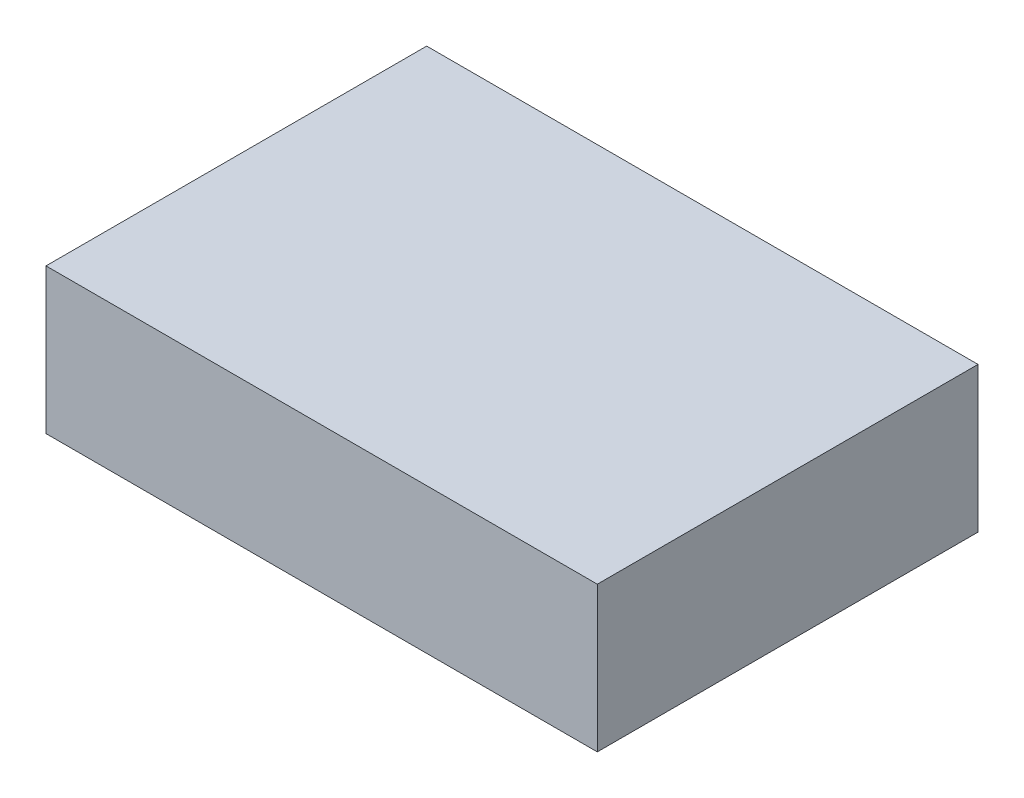
ISO-10303-21;
HEADER;
FILE_DESCRIPTION(('STEP AP214'),'2;1');
FILE_NAME('part.step','',(''),(''),'','','');
FILE_SCHEMA(('AUTOMOTIVE_DESIGN { 1 0 10303 214 1 1 1 1 }'));
ENDSEC;
DATA;
#1=APPLICATION_CONTEXT('core data for automotive mechanical design processes');
#2=APPLICATION_PROTOCOL_DEFINITION('international standard','automotive_design',2000,#1);
#3=PRODUCT_CONTEXT('',#1,'mechanical');
#4=PRODUCT('Part','Part','',(#3));
#5=PRODUCT_RELATED_PRODUCT_CATEGORY('part','',(#4));
#6=PRODUCT_DEFINITION_FORMATION('','',#4);
#7=PRODUCT_DEFINITION_CONTEXT('part definition',#1,'design');
#8=PRODUCT_DEFINITION('design','',#6,#7);
#9=PRODUCT_DEFINITION_SHAPE('','',#8);
#10=(LENGTH_UNIT() NAMED_UNIT(*) SI_UNIT(.MILLI.,.METRE.));
#11=(NAMED_UNIT(*) PLANE_ANGLE_UNIT() SI_UNIT($,.RADIAN.));
#12=(NAMED_UNIT(*) SI_UNIT($,.STERADIAN.) SOLID_ANGLE_UNIT());
#13=UNCERTAINTY_MEASURE_WITH_UNIT(LENGTH_MEASURE(1.E-05),#10,'distance_accuracy_value','');
#14=(GEOMETRIC_REPRESENTATION_CONTEXT(3) GLOBAL_UNCERTAINTY_ASSIGNED_CONTEXT((#13)) GLOBAL_UNIT_ASSIGNED_CONTEXT((#10,
#11,#12)) REPRESENTATION_CONTEXT('',''));
#15=CARTESIAN_POINT('',(0.,0.,0.));
#16=DIRECTION('',(0.,0.,1.));
#17=DIRECTION('',(1.,0.,0.));
#18=AXIS2_PLACEMENT_3D('',#15,#16,#17);
#19=CARTESIAN_POINT('',(16.51,8.7,-11.4));
#20=DIRECTION('',(-1.,0.,0.));
#21=DIRECTION('',(0.,0.,1.));
#22=AXIS2_PLACEMENT_3D('',#19,#20,#21);
#23=PLANE('',#22);
#24=DIRECTION('',(0.,0.,-1.));
#25=VECTOR('',#24,1.);
#26=CARTESIAN_POINT('',(16.51,0.,-11.4));
#27=LINE('',#26,#25);
#28=CARTESIAN_POINT('',(16.51,0.,11.4));
#29=VERTEX_POINT('',#28);
#30=CARTESIAN_POINT('',(16.51,0.,-11.4));
#31=VERTEX_POINT('',#30);
#32=EDGE_CURVE('E98',#29,#31,#27,.T.);
#33=ORIENTED_EDGE('',*,*,#32,.T.);
#34=DIRECTION('',(0.,-1.,0.));
#35=VECTOR('',#34,1.);
#36=CARTESIAN_POINT('',(16.51,8.7,-11.4));
#37=LINE('',#36,#35);
#38=CARTESIAN_POINT('',(16.51,8.7,-11.4));
#39=VERTEX_POINT('',#38);
#40=EDGE_CURVE('E11',#39,#31,#37,.T.);
#41=ORIENTED_EDGE('',*,*,#40,.F.);
#42=DIRECTION('',(0.,0.,-1.));
#43=VECTOR('',#42,1.);
#44=CARTESIAN_POINT('',(16.51,8.7,-11.4));
#45=LINE('',#44,#43);
#46=CARTESIAN_POINT('',(16.51,8.7,11.4));
#47=VERTEX_POINT('',#46);
#48=EDGE_CURVE('E86',#47,#39,#45,.T.);
#49=ORIENTED_EDGE('',*,*,#48,.F.);
#50=DIRECTION('',(0.,-1.,0.));
#51=VECTOR('',#50,1.);
#52=CARTESIAN_POINT('',(16.51,8.7,11.4));
#53=LINE('',#52,#51);
#54=EDGE_CURVE('E94',#47,#29,#53,.T.);
#55=ORIENTED_EDGE('',*,*,#54,.T.);
#56=EDGE_LOOP('',(#33,#41,#49,#55));
#57=FACE_BOUND('',#56,.T.);
#58=ADVANCED_FACE('F35',(#57),#23,.F.);
#59=CARTESIAN_POINT('',(-16.51,8.7,-11.4));
#60=DIRECTION('',(0.,0.,1.));
#61=DIRECTION('',(1.,0.,0.));
#62=AXIS2_PLACEMENT_3D('',#59,#60,#61);
#63=PLANE('',#62);
#64=DIRECTION('',(-1.,0.,0.));
#65=VECTOR('',#64,1.);
#66=CARTESIAN_POINT('',(-16.51,0.,-11.4));
#67=LINE('',#66,#65);
#68=CARTESIAN_POINT('',(-16.51,0.,-11.4));
#69=VERTEX_POINT('',#68);
#70=EDGE_CURVE('E90',#31,#69,#67,.T.);
#71=ORIENTED_EDGE('',*,*,#70,.T.);
#72=DIRECTION('',(0.,-1.,0.));
#73=VECTOR('',#72,1.);
#74=CARTESIAN_POINT('',(-16.51,8.7,-11.4));
#75=LINE('',#74,#73);
#76=CARTESIAN_POINT('',(-16.51,8.7,-11.4));
#77=VERTEX_POINT('',#76);
#78=EDGE_CURVE('E43',#77,#69,#75,.T.);
#79=ORIENTED_EDGE('',*,*,#78,.F.);
#80=DIRECTION('',(-1.,0.,0.));
#81=VECTOR('',#80,1.);
#82=CARTESIAN_POINT('',(-16.51,8.7,-11.4));
#83=LINE('',#82,#81);
#84=EDGE_CURVE('E81',#39,#77,#83,.T.);
#85=ORIENTED_EDGE('',*,*,#84,.F.);
#86=ORIENTED_EDGE('',*,*,#40,.T.);
#87=EDGE_LOOP('',(#71,#79,#85,#86));
#88=FACE_BOUND('',#87,.T.);
#89=ADVANCED_FACE('F89',(#88),#63,.F.);
#90=CARTESIAN_POINT('',(-16.51,8.7,-11.4));
#91=DIRECTION('',(1.,0.,0.));
#92=DIRECTION('',(0.,0.,-1.));
#93=AXIS2_PLACEMENT_3D('',#90,#91,#92);
#94=PLANE('',#93);
#95=DIRECTION('',(0.,0.,1.));
#96=VECTOR('',#95,1.);
#97=CARTESIAN_POINT('',(-16.51,0.,-11.4));
#98=LINE('',#97,#96);
#99=CARTESIAN_POINT('',(-16.51,0.,11.4));
#100=VERTEX_POINT('',#99);
#101=EDGE_CURVE('E68',#69,#100,#98,.T.);
#102=ORIENTED_EDGE('',*,*,#101,.T.);
#103=DIRECTION('',(0.,-1.,0.));
#104=VECTOR('',#103,1.);
#105=CARTESIAN_POINT('',(-16.51,8.7,11.4));
#106=LINE('',#105,#104);
#107=CARTESIAN_POINT('',(-16.51,8.7,11.4));
#108=VERTEX_POINT('',#107);
#109=EDGE_CURVE('E91',#108,#100,#106,.T.);
#110=ORIENTED_EDGE('',*,*,#109,.F.);
#111=DIRECTION('',(0.,0.,1.));
#112=VECTOR('',#111,1.);
#113=CARTESIAN_POINT('',(-16.51,8.7,-11.4));
#114=LINE('',#113,#112);
#115=EDGE_CURVE('E84',#77,#108,#114,.T.);
#116=ORIENTED_EDGE('',*,*,#115,.F.);
#117=ORIENTED_EDGE('',*,*,#78,.T.);
#118=EDGE_LOOP('',(#102,#110,#116,#117));
#119=FACE_BOUND('',#118,.T.);
#120=ADVANCED_FACE('F92',(#119),#94,.F.);
#121=CARTESIAN_POINT('',(-16.51,8.7,11.4));
#122=DIRECTION('',(0.,0.,-1.));
#123=DIRECTION('',(-1.,0.,0.));
#124=AXIS2_PLACEMENT_3D('',#121,#122,#123);
#125=PLANE('',#124);
#126=DIRECTION('',(1.,0.,0.));
#127=VECTOR('',#126,1.);
#128=CARTESIAN_POINT('',(-16.51,0.,11.4));
#129=LINE('',#128,#127);
#130=EDGE_CURVE('E74',#100,#29,#129,.T.);
#131=ORIENTED_EDGE('',*,*,#130,.T.);
#132=ORIENTED_EDGE('',*,*,#54,.F.);
#133=DIRECTION('',(1.,0.,0.));
#134=VECTOR('',#133,1.);
#135=CARTESIAN_POINT('',(-16.51,8.7,11.4));
#136=LINE('',#135,#134);
#137=EDGE_CURVE('E51',#108,#47,#136,.T.);
#138=ORIENTED_EDGE('',*,*,#137,.F.);
#139=ORIENTED_EDGE('',*,*,#109,.T.);
#140=EDGE_LOOP('',(#131,#132,#138,#139));
#141=FACE_BOUND('',#140,.T.);
#142=ADVANCED_FACE('F105',(#141),#125,.F.);
#143=CARTESIAN_POINT('',(0.,8.7,0.));
#144=DIRECTION('',(0.,1.,0.));
#145=DIRECTION('',(0.,0.,1.));
#146=AXIS2_PLACEMENT_3D('',#143,#144,#145);
#147=PLANE('',#146);
#148=ORIENTED_EDGE('',*,*,#48,.T.);
#149=ORIENTED_EDGE('',*,*,#84,.T.);
#150=ORIENTED_EDGE('',*,*,#115,.T.);
#151=ORIENTED_EDGE('',*,*,#137,.T.);
#152=EDGE_LOOP('',(#148,#149,#150,#151));
#153=FACE_BOUND('',#152,.T.);
#154=ADVANCED_FACE('F82',(#153),#147,.T.);
#155=CARTESIAN_POINT('',(0.,0.,0.));
#156=DIRECTION('',(0.,1.,0.));
#157=DIRECTION('',(0.,0.,1.));
#158=AXIS2_PLACEMENT_3D('',#155,#156,#157);
#159=PLANE('',#158);
#160=ORIENTED_EDGE('',*,*,#32,.F.);
#161=ORIENTED_EDGE('',*,*,#130,.F.);
#162=ORIENTED_EDGE('',*,*,#101,.F.);
#163=ORIENTED_EDGE('',*,*,#70,.F.);
#164=EDGE_LOOP('',(#160,#161,#162,#163));
#165=FACE_BOUND('',#164,.T.);
#166=ADVANCED_FACE('F108',(#165),#159,.F.);
#167=CLOSED_SHELL('',(#58,#89,#120,#142,#154,#166));
#168=MANIFOLD_SOLID_BREP('B2',#167);
#169=ADVANCED_BREP_SHAPE_REPRESENTATION('',(#18,#168),#14);
#170=SHAPE_DEFINITION_REPRESENTATION(#9,#169);
ENDSEC;
END-ISO-10303-21;
